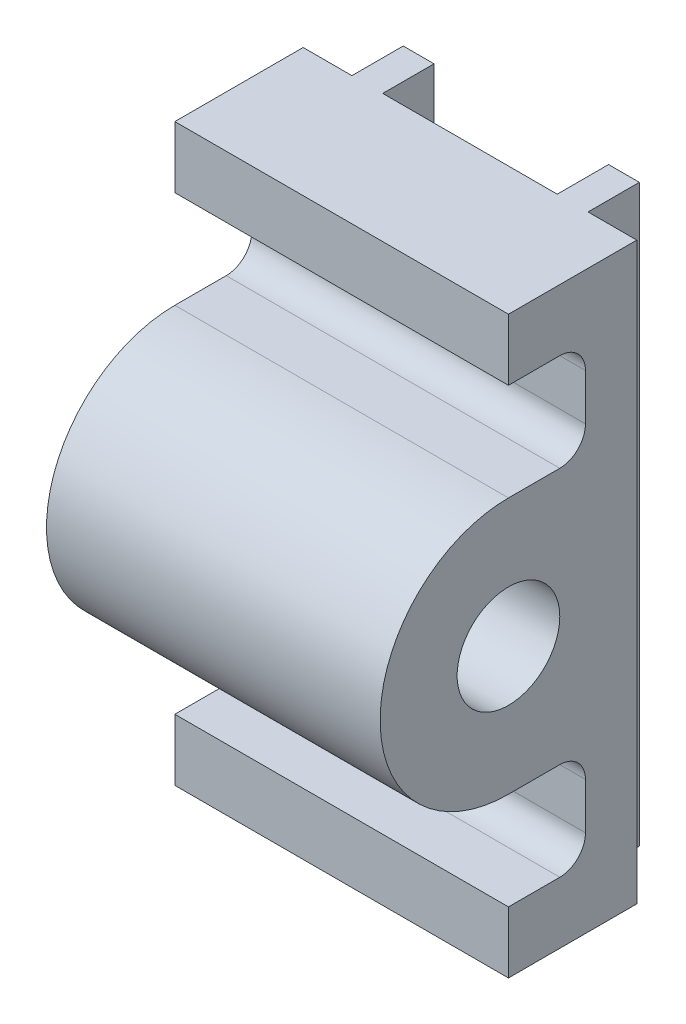
ISO-10303-21;
HEADER;
FILE_DESCRIPTION(('STEP AP214'),'2;1');
FILE_NAME('part.step','',(''),(''),'','','');
FILE_SCHEMA(('AUTOMOTIVE_DESIGN { 1 0 10303 214 1 1 1 1 }'));
ENDSEC;
DATA;
#1=APPLICATION_CONTEXT('core data for automotive mechanical design processes');
#2=APPLICATION_PROTOCOL_DEFINITION('international standard','automotive_design',2000,#1);
#3=PRODUCT_CONTEXT('',#1,'mechanical');
#4=PRODUCT('Part','Part','',(#3));
#5=PRODUCT_RELATED_PRODUCT_CATEGORY('part','',(#4));
#6=PRODUCT_DEFINITION_FORMATION('','',#4);
#7=PRODUCT_DEFINITION_CONTEXT('part definition',#1,'design');
#8=PRODUCT_DEFINITION('design','',#6,#7);
#9=PRODUCT_DEFINITION_SHAPE('','',#8);
#10=(LENGTH_UNIT() NAMED_UNIT(*) SI_UNIT(.MILLI.,.METRE.));
#11=(NAMED_UNIT(*) PLANE_ANGLE_UNIT() SI_UNIT($,.RADIAN.));
#12=(NAMED_UNIT(*) SI_UNIT($,.STERADIAN.) SOLID_ANGLE_UNIT());
#13=UNCERTAINTY_MEASURE_WITH_UNIT(LENGTH_MEASURE(1.E-05),#10,'distance_accuracy_value','');
#14=(GEOMETRIC_REPRESENTATION_CONTEXT(3) GLOBAL_UNCERTAINTY_ASSIGNED_CONTEXT((#13)) GLOBAL_UNIT_ASSIGNED_CONTEXT((#10,
#11,#12)) REPRESENTATION_CONTEXT('',''));
#15=CARTESIAN_POINT('',(0.,0.,0.));
#16=DIRECTION('',(0.,0.,1.));
#17=DIRECTION('',(1.,0.,0.));
#18=AXIS2_PLACEMENT_3D('',#15,#16,#17);
#19=CARTESIAN_POINT('',(32.5,-56.,-25.));
#20=DIRECTION('',(0.,0.,1.));
#21=DIRECTION('',(1.,0.,0.));
#22=AXIS2_PLACEMENT_3D('',#19,#20,#21);
#23=PLANE('',#22);
#24=DIRECTION('',(0.,1.,0.));
#25=VECTOR('',#24,1.);
#26=CARTESIAN_POINT('',(-23.,-56.,-25.));
#27=LINE('',#26,#25);
#28=CARTESIAN_POINT('',(-23.,-56.,-25.));
#29=VERTEX_POINT('',#28);
#30=CARTESIAN_POINT('',(-23.,56.,-25.));
#31=VERTEX_POINT('',#30);
#32=EDGE_CURVE('E54',#29,#31,#27,.T.);
#33=ORIENTED_EDGE('',*,*,#32,.F.);
#34=DIRECTION('',(-1.,0.,0.));
#35=VECTOR('',#34,1.);
#36=CARTESIAN_POINT('',(32.5,-56.,-25.));
#37=LINE('',#36,#35);
#38=CARTESIAN_POINT('',(-32.5,-56.,-25.));
#39=VERTEX_POINT('',#38);
#40=EDGE_CURVE('E352',#29,#39,#37,.T.);
#41=ORIENTED_EDGE('',*,*,#40,.T.);
#42=DIRECTION('',(0.,1.,0.));
#43=VECTOR('',#42,1.);
#44=CARTESIAN_POINT('',(-32.5,-56.,-25.));
#45=LINE('',#44,#43);
#46=CARTESIAN_POINT('',(-32.5,56.,-25.));
#47=VERTEX_POINT('',#46);
#48=EDGE_CURVE('E312',#39,#47,#45,.T.);
#49=ORIENTED_EDGE('',*,*,#48,.T.);
#50=DIRECTION('',(-1.,0.,0.));
#51=VECTOR('',#50,1.);
#52=CARTESIAN_POINT('',(32.5,56.,-25.));
#53=LINE('',#52,#51);
#54=EDGE_CURVE('E348',#31,#47,#53,.T.);
#55=ORIENTED_EDGE('',*,*,#54,.F.);
#56=EDGE_LOOP('',(#33,#41,#49,#55));
#57=FACE_BOUND('',#56,.T.);
#58=ADVANCED_FACE('F39',(#57),#23,.F.);
#59=DIRECTION('',(0.,-1.,0.));
#60=VECTOR('',#59,1.);
#61=CARTESIAN_POINT('',(-17.,-56.,-25.));
#62=LINE('',#61,#60);
#63=CARTESIAN_POINT('',(-17.,56.,-25.));
#64=VERTEX_POINT('',#63);
#65=CARTESIAN_POINT('',(-17.,-56.,-25.));
#66=VERTEX_POINT('',#65);
#67=EDGE_CURVE('E220',#64,#66,#62,.T.);
#68=ORIENTED_EDGE('',*,*,#67,.F.);
#69=CARTESIAN_POINT('',(17.,56.,-25.));
#70=VERTEX_POINT('',#69);
#71=EDGE_CURVE('E353',#70,#64,#53,.T.);
#72=ORIENTED_EDGE('',*,*,#71,.F.);
#73=DIRECTION('',(0.,1.,0.));
#74=VECTOR('',#73,1.);
#75=CARTESIAN_POINT('',(17.,-56.,-25.));
#76=LINE('',#75,#74);
#77=CARTESIAN_POINT('',(17.,-56.,-25.));
#78=VERTEX_POINT('',#77);
#79=EDGE_CURVE('E62',#78,#70,#76,.T.);
#80=ORIENTED_EDGE('',*,*,#79,.F.);
#81=EDGE_CURVE('E357',#78,#66,#37,.T.);
#82=ORIENTED_EDGE('',*,*,#81,.T.);
#83=EDGE_LOOP('',(#68,#72,#80,#82));
#84=FACE_BOUND('',#83,.T.);
#85=ADVANCED_FACE('F457',(#84),#23,.F.);
#86=DIRECTION('',(0.,-1.,0.));
#87=VECTOR('',#86,1.);
#88=CARTESIAN_POINT('',(23.,-56.,-25.));
#89=LINE('',#88,#87);
#90=CARTESIAN_POINT('',(23.,56.,-25.));
#91=VERTEX_POINT('',#90);
#92=CARTESIAN_POINT('',(23.,-56.,-25.));
#93=VERTEX_POINT('',#92);
#94=EDGE_CURVE('E246',#91,#93,#89,.T.);
#95=ORIENTED_EDGE('',*,*,#94,.F.);
#96=CARTESIAN_POINT('',(32.5,56.,-25.));
#97=VERTEX_POINT('',#96);
#98=EDGE_CURVE('E349',#97,#91,#53,.T.);
#99=ORIENTED_EDGE('',*,*,#98,.F.);
#100=DIRECTION('',(0.,1.,0.));
#101=VECTOR('',#100,1.);
#102=CARTESIAN_POINT('',(32.5,-56.,-25.));
#103=LINE('',#102,#101);
#104=CARTESIAN_POINT('',(32.5,-56.,-25.));
#105=VERTEX_POINT('',#104);
#106=EDGE_CURVE('E278',#105,#97,#103,.T.);
#107=ORIENTED_EDGE('',*,*,#106,.F.);
#108=EDGE_CURVE('E354',#105,#93,#37,.T.);
#109=ORIENTED_EDGE('',*,*,#108,.T.);
#110=EDGE_LOOP('',(#95,#99,#107,#109));
#111=FACE_BOUND('',#110,.T.);
#112=ADVANCED_FACE('F459',(#111),#23,.F.);
#113=CARTESIAN_POINT('',(32.5,0.,0.));
#114=DIRECTION('',(1.,0.,0.));
#115=DIRECTION('',(0.,0.,-1.));
#116=AXIS2_PLACEMENT_3D('',#113,#114,#115);
#117=PLANE('',#116);
#118=CARTESIAN_POINT('',(32.5,0.,0.));
#119=DIRECTION('',(1.,0.,0.));
#120=DIRECTION('',(0.,0.,-1.));
#121=AXIS2_PLACEMENT_3D('',#118,#119,#120);
#122=CIRCLE('',#121,25.);
#123=CARTESIAN_POINT('',(32.5,25.,0.));
#124=VERTEX_POINT('',#123);
#125=CARTESIAN_POINT('',(32.5,-25.,0.));
#126=VERTEX_POINT('',#125);
#127=EDGE_CURVE('E260',#124,#126,#122,.T.);
#128=ORIENTED_EDGE('',*,*,#127,.T.);
#129=DIRECTION('',(0.,0.,-1.));
#130=VECTOR('',#129,1.);
#131=CARTESIAN_POINT('',(32.5,-25.,0.));
#132=LINE('',#131,#130);
#133=CARTESIAN_POINT('',(32.5,-25.,-9.99999999999999));
#134=VERTEX_POINT('',#133);
#135=EDGE_CURVE('E263',#126,#134,#132,.T.);
#136=ORIENTED_EDGE('',*,*,#135,.T.);
#137=CARTESIAN_POINT('',(32.5,-30.,-9.99999999999999));
#138=DIRECTION('',(-1.,0.,0.));
#139=DIRECTION('',(0.,0.,1.));
#140=AXIS2_PLACEMENT_3D('',#137,#138,#139);
#141=CIRCLE('',#140,5.);
#142=CARTESIAN_POINT('',(32.5,-30.,-15.));
#143=VERTEX_POINT('',#142);
#144=EDGE_CURVE('E266',#134,#143,#141,.T.);
#145=ORIENTED_EDGE('',*,*,#144,.T.);
#146=DIRECTION('',(0.,-1.,0.));
#147=VECTOR('',#146,1.);
#148=CARTESIAN_POINT('',(32.5,-30.,-15.));
#149=LINE('',#148,#147);
#150=CARTESIAN_POINT('',(32.5,-39.,-15.));
#151=VERTEX_POINT('',#150);
#152=EDGE_CURVE('E268',#143,#151,#149,.T.);
#153=ORIENTED_EDGE('',*,*,#152,.T.);
#154=CARTESIAN_POINT('',(32.5,-39.,-10.));
#155=DIRECTION('',(-1.,0.,0.));
#156=DIRECTION('',(0.,0.,1.));
#157=AXIS2_PLACEMENT_3D('',#154,#155,#156);
#158=CIRCLE('',#157,5.);
#159=CARTESIAN_POINT('',(32.5,-44.,-10.));
#160=VERTEX_POINT('',#159);
#161=EDGE_CURVE('E270',#151,#160,#158,.T.);
#162=ORIENTED_EDGE('',*,*,#161,.T.);
#163=DIRECTION('',(0.,0.,1.));
#164=VECTOR('',#163,1.);
#165=CARTESIAN_POINT('',(32.5,-44.,-10.));
#166=LINE('',#165,#164);
#167=CARTESIAN_POINT('',(32.5,-44.,0.));
#168=VERTEX_POINT('',#167);
#169=EDGE_CURVE('E272',#160,#168,#166,.T.);
#170=ORIENTED_EDGE('',*,*,#169,.T.);
#171=DIRECTION('',(0.,-1.,0.));
#172=VECTOR('',#171,1.);
#173=CARTESIAN_POINT('',(32.5,-44.,0.));
#174=LINE('',#173,#172);
#175=CARTESIAN_POINT('',(32.5,-56.,0.));
#176=VERTEX_POINT('',#175);
#177=EDGE_CURVE('E274',#168,#176,#174,.T.);
#178=ORIENTED_EDGE('',*,*,#177,.T.);
#179=DIRECTION('',(0.,0.,-1.));
#180=VECTOR('',#179,1.);
#181=CARTESIAN_POINT('',(32.5,-56.,0.));
#182=LINE('',#181,#180);
#183=EDGE_CURVE('E276',#176,#105,#182,.T.);
#184=ORIENTED_EDGE('',*,*,#183,.T.);
#185=ORIENTED_EDGE('',*,*,#106,.T.);
#186=DIRECTION('',(0.,0.,1.));
#187=VECTOR('',#186,1.);
#188=CARTESIAN_POINT('',(32.5,56.,0.));
#189=LINE('',#188,#187);
#190=CARTESIAN_POINT('',(32.5,56.,0.));
#191=VERTEX_POINT('',#190);
#192=EDGE_CURVE('E280',#97,#191,#189,.T.);
#193=ORIENTED_EDGE('',*,*,#192,.T.);
#194=DIRECTION('',(0.,-1.,0.));
#195=VECTOR('',#194,1.);
#196=CARTESIAN_POINT('',(32.5,44.,0.));
#197=LINE('',#196,#195);
#198=CARTESIAN_POINT('',(32.5,44.,0.));
#199=VERTEX_POINT('',#198);
#200=EDGE_CURVE('E282',#191,#199,#197,.T.);
#201=ORIENTED_EDGE('',*,*,#200,.T.);
#202=DIRECTION('',(0.,0.,-1.));
#203=VECTOR('',#202,1.);
#204=CARTESIAN_POINT('',(32.5,44.,-10.));
#205=LINE('',#204,#203);
#206=CARTESIAN_POINT('',(32.5,44.,-10.));
#207=VERTEX_POINT('',#206);
#208=EDGE_CURVE('E284',#199,#207,#205,.T.);
#209=ORIENTED_EDGE('',*,*,#208,.T.);
#210=CARTESIAN_POINT('',(32.5,39.,-10.));
#211=DIRECTION('',(-1.,0.,0.));
#212=DIRECTION('',(0.,0.,-1.));
#213=AXIS2_PLACEMENT_3D('',#210,#211,#212);
#214=CIRCLE('',#213,5.);
#215=CARTESIAN_POINT('',(32.5,39.,-15.));
#216=VERTEX_POINT('',#215);
#217=EDGE_CURVE('E286',#207,#216,#214,.T.);
#218=ORIENTED_EDGE('',*,*,#217,.T.);
#219=DIRECTION('',(0.,-1.,0.));
#220=VECTOR('',#219,1.);
#221=CARTESIAN_POINT('',(32.5,30.,-15.));
#222=LINE('',#221,#220);
#223=CARTESIAN_POINT('',(32.5,30.,-15.));
#224=VERTEX_POINT('',#223);
#225=EDGE_CURVE('E288',#216,#224,#222,.T.);
#226=ORIENTED_EDGE('',*,*,#225,.T.);
#227=CARTESIAN_POINT('',(32.5,30.,-9.99999999999999));
#228=DIRECTION('',(-1.,0.,0.));
#229=DIRECTION('',(0.,0.,-1.));
#230=AXIS2_PLACEMENT_3D('',#227,#228,#229);
#231=CIRCLE('',#230,5.);
#232=CARTESIAN_POINT('',(32.5,25.,-9.99999999999999));
#233=VERTEX_POINT('',#232);
#234=EDGE_CURVE('E290',#224,#233,#231,.T.);
#235=ORIENTED_EDGE('',*,*,#234,.T.);
#236=DIRECTION('',(0.,0.,1.));
#237=VECTOR('',#236,1.);
#238=CARTESIAN_POINT('',(32.5,25.,0.));
#239=LINE('',#238,#237);
#240=EDGE_CURVE('E292',#233,#124,#239,.T.);
#241=ORIENTED_EDGE('',*,*,#240,.T.);
#242=EDGE_LOOP('',(#128,#136,#145,#153,#162,#170,#178,#184,#185,#193,#201,#209,#218,#226,#235,#241));
#243=FACE_BOUND('',#242,.T.);
#244=CARTESIAN_POINT('',(32.5,0.,0.));
#245=DIRECTION('',(1.,0.,0.));
#246=DIRECTION('',(0.,0.,-1.));
#247=AXIS2_PLACEMENT_3D('',#244,#245,#246);
#248=CIRCLE('',#247,10.);
#249=CARTESIAN_POINT('',(32.5,0.,-10.));
#250=VERTEX_POINT('',#249);
#251=EDGE_CURVE('E226',#250,#250,#248,.T.);
#252=ORIENTED_EDGE('',*,*,#251,.F.);
#253=EDGE_LOOP('',(#252));
#254=FACE_BOUND('',#253,.T.);
#255=ADVANCED_FACE('F396',(#243,#254),#117,.T.);
#256=CARTESIAN_POINT('',(-32.5,0.,0.));
#257=DIRECTION('',(1.,0.,0.));
#258=DIRECTION('',(0.,0.,-1.));
#259=AXIS2_PLACEMENT_3D('',#256,#257,#258);
#260=PLANE('',#259);
#261=CARTESIAN_POINT('',(-32.5,0.,0.));
#262=DIRECTION('',(1.,0.,0.));
#263=DIRECTION('',(0.,0.,-1.));
#264=AXIS2_PLACEMENT_3D('',#261,#262,#263);
#265=CIRCLE('',#264,25.);
#266=CARTESIAN_POINT('',(-32.5,25.,0.));
#267=VERTEX_POINT('',#266);
#268=CARTESIAN_POINT('',(-32.5,-25.,0.));
#269=VERTEX_POINT('',#268);
#270=EDGE_CURVE('E258',#267,#269,#265,.T.);
#271=ORIENTED_EDGE('',*,*,#270,.F.);
#272=DIRECTION('',(0.,0.,1.));
#273=VECTOR('',#272,1.);
#274=CARTESIAN_POINT('',(-32.5,25.,0.));
#275=LINE('',#274,#273);
#276=CARTESIAN_POINT('',(-32.5,25.,-9.99999999999999));
#277=VERTEX_POINT('',#276);
#278=EDGE_CURVE('E264',#277,#267,#275,.T.);
#279=ORIENTED_EDGE('',*,*,#278,.F.);
#280=CARTESIAN_POINT('',(-32.5,30.,-9.99999999999999));
#281=DIRECTION('',(-1.,0.,0.));
#282=DIRECTION('',(0.,0.,-1.));
#283=AXIS2_PLACEMENT_3D('',#280,#281,#282);
#284=CIRCLE('',#283,5.);
#285=CARTESIAN_POINT('',(-32.5,30.,-15.));
#286=VERTEX_POINT('',#285);
#287=EDGE_CURVE('E325',#286,#277,#284,.T.);
#288=ORIENTED_EDGE('',*,*,#287,.F.);
#289=DIRECTION('',(0.,-1.,0.));
#290=VECTOR('',#289,1.);
#291=CARTESIAN_POINT('',(-32.5,30.,-15.));
#292=LINE('',#291,#290);
#293=CARTESIAN_POINT('',(-32.5,39.,-15.));
#294=VERTEX_POINT('',#293);
#295=EDGE_CURVE('E323',#294,#286,#292,.T.);
#296=ORIENTED_EDGE('',*,*,#295,.F.);
#297=CARTESIAN_POINT('',(-32.5,39.,-10.));
#298=DIRECTION('',(-1.,0.,0.));
#299=DIRECTION('',(0.,0.,-1.));
#300=AXIS2_PLACEMENT_3D('',#297,#298,#299);
#301=CIRCLE('',#300,5.);
#302=CARTESIAN_POINT('',(-32.5,44.,-10.));
#303=VERTEX_POINT('',#302);
#304=EDGE_CURVE('E321',#303,#294,#301,.T.);
#305=ORIENTED_EDGE('',*,*,#304,.F.);
#306=DIRECTION('',(0.,0.,-1.));
#307=VECTOR('',#306,1.);
#308=CARTESIAN_POINT('',(-32.5,44.,-10.));
#309=LINE('',#308,#307);
#310=CARTESIAN_POINT('',(-32.5,44.,0.));
#311=VERTEX_POINT('',#310);
#312=EDGE_CURVE('E319',#311,#303,#309,.T.);
#313=ORIENTED_EDGE('',*,*,#312,.F.);
#314=DIRECTION('',(0.,-1.,0.));
#315=VECTOR('',#314,1.);
#316=CARTESIAN_POINT('',(-32.5,44.,0.));
#317=LINE('',#316,#315);
#318=CARTESIAN_POINT('',(-32.5,56.,0.));
#319=VERTEX_POINT('',#318);
#320=EDGE_CURVE('E317',#319,#311,#317,.T.);
#321=ORIENTED_EDGE('',*,*,#320,.F.);
#322=DIRECTION('',(0.,0.,1.));
#323=VECTOR('',#322,1.);
#324=CARTESIAN_POINT('',(-32.5,56.,0.));
#325=LINE('',#324,#323);
#326=EDGE_CURVE('E315',#47,#319,#325,.T.);
#327=ORIENTED_EDGE('',*,*,#326,.F.);
#328=ORIENTED_EDGE('',*,*,#48,.F.);
#329=DIRECTION('',(0.,0.,-1.));
#330=VECTOR('',#329,1.);
#331=CARTESIAN_POINT('',(-32.5,-56.,0.));
#332=LINE('',#331,#330);
#333=CARTESIAN_POINT('',(-32.5,-56.,0.));
#334=VERTEX_POINT('',#333);
#335=EDGE_CURVE('E309',#334,#39,#332,.T.);
#336=ORIENTED_EDGE('',*,*,#335,.F.);
#337=DIRECTION('',(0.,-1.,0.));
#338=VECTOR('',#337,1.);
#339=CARTESIAN_POINT('',(-32.5,-44.,0.));
#340=LINE('',#339,#338);
#341=CARTESIAN_POINT('',(-32.5,-44.,0.));
#342=VERTEX_POINT('',#341);
#343=EDGE_CURVE('E307',#342,#334,#340,.T.);
#344=ORIENTED_EDGE('',*,*,#343,.F.);
#345=DIRECTION('',(0.,0.,1.));
#346=VECTOR('',#345,1.);
#347=CARTESIAN_POINT('',(-32.5,-44.,-10.));
#348=LINE('',#347,#346);
#349=CARTESIAN_POINT('',(-32.5,-44.,-10.));
#350=VERTEX_POINT('',#349);
#351=EDGE_CURVE('E305',#350,#342,#348,.T.);
#352=ORIENTED_EDGE('',*,*,#351,.F.);
#353=CARTESIAN_POINT('',(-32.5,-39.,-10.));
#354=DIRECTION('',(-1.,0.,0.));
#355=DIRECTION('',(0.,0.,1.));
#356=AXIS2_PLACEMENT_3D('',#353,#354,#355);
#357=CIRCLE('',#356,5.);
#358=CARTESIAN_POINT('',(-32.5,-39.,-15.));
#359=VERTEX_POINT('',#358);
#360=EDGE_CURVE('E303',#359,#350,#357,.T.);
#361=ORIENTED_EDGE('',*,*,#360,.F.);
#362=DIRECTION('',(0.,-1.,0.));
#363=VECTOR('',#362,1.);
#364=CARTESIAN_POINT('',(-32.5,-30.,-15.));
#365=LINE('',#364,#363);
#366=CARTESIAN_POINT('',(-32.5,-30.,-15.));
#367=VERTEX_POINT('',#366);
#368=EDGE_CURVE('E301',#367,#359,#365,.T.);
#369=ORIENTED_EDGE('',*,*,#368,.F.);
#370=CARTESIAN_POINT('',(-32.5,-30.,-9.99999999999999));
#371=DIRECTION('',(-1.,0.,0.));
#372=DIRECTION('',(0.,0.,1.));
#373=AXIS2_PLACEMENT_3D('',#370,#371,#372);
#374=CIRCLE('',#373,5.);
#375=CARTESIAN_POINT('',(-32.5,-25.,-9.99999999999999));
#376=VERTEX_POINT('',#375);
#377=EDGE_CURVE('E299',#376,#367,#374,.T.);
#378=ORIENTED_EDGE('',*,*,#377,.F.);
#379=DIRECTION('',(0.,0.,-1.));
#380=VECTOR('',#379,1.);
#381=CARTESIAN_POINT('',(-32.5,-25.,0.));
#382=LINE('',#381,#380);
#383=EDGE_CURVE('E297',#269,#376,#382,.T.);
#384=ORIENTED_EDGE('',*,*,#383,.F.);
#385=EDGE_LOOP('',(#271,#279,#288,#296,#305,#313,#321,#327,#328,#336,#344,#352,#361,#369,#378,#384));
#386=FACE_BOUND('',#385,.T.);
#387=CARTESIAN_POINT('',(-32.5,0.,0.));
#388=DIRECTION('',(1.,0.,0.));
#389=DIRECTION('',(0.,0.,-1.));
#390=AXIS2_PLACEMENT_3D('',#387,#388,#389);
#391=CIRCLE('',#390,10.);
#392=CARTESIAN_POINT('',(-32.5,0.,-10.));
#393=VERTEX_POINT('',#392);
#394=EDGE_CURVE('E223',#393,#393,#391,.T.);
#395=ORIENTED_EDGE('',*,*,#394,.T.);
#396=EDGE_LOOP('',(#395));
#397=FACE_BOUND('',#396,.T.);
#398=ADVANCED_FACE('F382',(#386,#397),#260,.F.);
#399=CARTESIAN_POINT('',(32.5,0.,0.));
#400=DIRECTION('',(-1.,0.,0.));
#401=DIRECTION('',(0.,0.,1.));
#402=AXIS2_PLACEMENT_3D('',#399,#400,#401);
#403=CYLINDRICAL_SURFACE('',#402,25.);
#404=ORIENTED_EDGE('',*,*,#270,.T.);
#405=DIRECTION('',(-1.,0.,0.));
#406=VECTOR('',#405,1.);
#407=CARTESIAN_POINT('',(32.5,-25.,0.));
#408=LINE('',#407,#406);
#409=EDGE_CURVE('E11',#126,#269,#408,.T.);
#410=ORIENTED_EDGE('',*,*,#409,.F.);
#411=ORIENTED_EDGE('',*,*,#127,.F.);
#412=DIRECTION('',(-1.,0.,0.));
#413=VECTOR('',#412,1.);
#414=CARTESIAN_POINT('',(32.5,25.,0.));
#415=LINE('',#414,#413);
#416=EDGE_CURVE('E294',#124,#267,#415,.T.);
#417=ORIENTED_EDGE('',*,*,#416,.T.);
#418=EDGE_LOOP('',(#404,#410,#411,#417));
#419=FACE_BOUND('',#418,.T.);
#420=ADVANCED_FACE('F41',(#419),#403,.T.);
#421=CARTESIAN_POINT('',(32.5,-25.,0.));
#422=DIRECTION('',(0.,1.,0.));
#423=DIRECTION('',(0.,0.,1.));
#424=AXIS2_PLACEMENT_3D('',#421,#422,#423);
#425=PLANE('',#424);
#426=ORIENTED_EDGE('',*,*,#383,.T.);
#427=DIRECTION('',(-1.,0.,0.));
#428=VECTOR('',#427,1.);
#429=CARTESIAN_POINT('',(32.5,-25.,-9.99999999999999));
#430=LINE('',#429,#428);
#431=EDGE_CURVE('E47',#134,#376,#430,.T.);
#432=ORIENTED_EDGE('',*,*,#431,.F.);
#433=ORIENTED_EDGE('',*,*,#135,.F.);
#434=ORIENTED_EDGE('',*,*,#409,.T.);
#435=EDGE_LOOP('',(#426,#432,#433,#434));
#436=FACE_BOUND('',#435,.T.);
#437=ADVANCED_FACE('F401',(#436),#425,.F.);
#438=CARTESIAN_POINT('',(32.5,-30.,-9.99999999999999));
#439=DIRECTION('',(-1.,0.,0.));
#440=DIRECTION('',(0.,0.,1.));
#441=AXIS2_PLACEMENT_3D('',#438,#439,#440);
#442=CYLINDRICAL_SURFACE('',#441,5.);
#443=ORIENTED_EDGE('',*,*,#377,.T.);
#444=DIRECTION('',(-1.,0.,0.));
#445=VECTOR('',#444,1.);
#446=CARTESIAN_POINT('',(32.5,-30.,-15.));
#447=LINE('',#446,#445);
#448=EDGE_CURVE('E369',#143,#367,#447,.T.);
#449=ORIENTED_EDGE('',*,*,#448,.F.);
#450=ORIENTED_EDGE('',*,*,#144,.F.);
#451=ORIENTED_EDGE('',*,*,#431,.T.);
#452=EDGE_LOOP('',(#443,#449,#450,#451));
#453=FACE_BOUND('',#452,.T.);
#454=ADVANCED_FACE('F376',(#453),#442,.F.);
#455=CARTESIAN_POINT('',(32.5,-30.,-15.));
#456=DIRECTION('',(0.,0.,-1.));
#457=DIRECTION('',(0.,1.,0.));
#458=AXIS2_PLACEMENT_3D('',#455,#456,#457);
#459=PLANE('',#458);
#460=ORIENTED_EDGE('',*,*,#368,.T.);
#461=DIRECTION('',(-1.,0.,0.));
#462=VECTOR('',#461,1.);
#463=CARTESIAN_POINT('',(32.5,-39.,-15.));
#464=LINE('',#463,#462);
#465=EDGE_CURVE('E366',#151,#359,#464,.T.);
#466=ORIENTED_EDGE('',*,*,#465,.F.);
#467=ORIENTED_EDGE('',*,*,#152,.F.);
#468=ORIENTED_EDGE('',*,*,#448,.T.);
#469=EDGE_LOOP('',(#460,#466,#467,#468));
#470=FACE_BOUND('',#469,.T.);
#471=ADVANCED_FACE('F388',(#470),#459,.F.);
#472=CARTESIAN_POINT('',(32.5,-39.,-10.));
#473=DIRECTION('',(-1.,0.,0.));
#474=DIRECTION('',(0.,0.,1.));
#475=AXIS2_PLACEMENT_3D('',#472,#473,#474);
#476=CYLINDRICAL_SURFACE('',#475,5.);
#477=ORIENTED_EDGE('',*,*,#360,.T.);
#478=DIRECTION('',(-1.,0.,0.));
#479=VECTOR('',#478,1.);
#480=CARTESIAN_POINT('',(32.5,-44.,-10.));
#481=LINE('',#480,#479);
#482=EDGE_CURVE('E363',#160,#350,#481,.T.);
#483=ORIENTED_EDGE('',*,*,#482,.F.);
#484=ORIENTED_EDGE('',*,*,#161,.F.);
#485=ORIENTED_EDGE('',*,*,#465,.T.);
#486=EDGE_LOOP('',(#477,#483,#484,#485));
#487=FACE_BOUND('',#486,.T.);
#488=ADVANCED_FACE('F392',(#487),#476,.F.);
#489=CARTESIAN_POINT('',(32.5,-44.,-10.));
#490=DIRECTION('',(0.,-1.,0.));
#491=DIRECTION('',(0.,0.,-1.));
#492=AXIS2_PLACEMENT_3D('',#489,#490,#491);
#493=PLANE('',#492);
#494=ORIENTED_EDGE('',*,*,#351,.T.);
#495=DIRECTION('',(-1.,0.,0.));
#496=VECTOR('',#495,1.);
#497=CARTESIAN_POINT('',(32.5,-44.,0.));
#498=LINE('',#497,#496);
#499=EDGE_CURVE('E360',#168,#342,#498,.T.);
#500=ORIENTED_EDGE('',*,*,#499,.F.);
#501=ORIENTED_EDGE('',*,*,#169,.F.);
#502=ORIENTED_EDGE('',*,*,#482,.T.);
#503=EDGE_LOOP('',(#494,#500,#501,#502));
#504=FACE_BOUND('',#503,.T.);
#505=ADVANCED_FACE('F447',(#504),#493,.F.);
#506=CARTESIAN_POINT('',(32.5,-44.,0.));
#507=DIRECTION('',(0.,0.,-1.));
#508=DIRECTION('',(0.,1.,0.));
#509=AXIS2_PLACEMENT_3D('',#506,#507,#508);
#510=PLANE('',#509);
#511=ORIENTED_EDGE('',*,*,#343,.T.);
#512=DIRECTION('',(-1.,0.,0.));
#513=VECTOR('',#512,1.);
#514=CARTESIAN_POINT('',(32.5,-56.,0.));
#515=LINE('',#514,#513);
#516=EDGE_CURVE('E356',#176,#334,#515,.T.);
#517=ORIENTED_EDGE('',*,*,#516,.F.);
#518=ORIENTED_EDGE('',*,*,#177,.F.);
#519=ORIENTED_EDGE('',*,*,#499,.T.);
#520=EDGE_LOOP('',(#511,#517,#518,#519));
#521=FACE_BOUND('',#520,.T.);
#522=ADVANCED_FACE('F444',(#521),#510,.F.);
#523=CARTESIAN_POINT('',(32.5,-56.,0.));
#524=DIRECTION('',(0.,1.,0.));
#525=DIRECTION('',(0.,0.,1.));
#526=AXIS2_PLACEMENT_3D('',#523,#524,#525);
#527=PLANE('',#526);
#528=ORIENTED_EDGE('',*,*,#335,.T.);
#529=ORIENTED_EDGE('',*,*,#40,.F.);
#530=DIRECTION('',(0.,0.,1.));
#531=VECTOR('',#530,1.);
#532=CARTESIAN_POINT('',(-23.,-56.,-35.));
#533=LINE('',#532,#531);
#534=CARTESIAN_POINT('',(-23.,-56.,-35.));
#535=VERTEX_POINT('',#534);
#536=EDGE_CURVE('E498',#535,#29,#533,.T.);
#537=ORIENTED_EDGE('',*,*,#536,.F.);
#538=DIRECTION('',(-1.,0.,0.));
#539=VECTOR('',#538,1.);
#540=CARTESIAN_POINT('',(-23.,-56.,-35.));
#541=LINE('',#540,#539);
#542=CARTESIAN_POINT('',(-17.,-56.,-35.));
#543=VERTEX_POINT('',#542);
#544=EDGE_CURVE('E216',#543,#535,#541,.T.);
#545=ORIENTED_EDGE('',*,*,#544,.F.);
#546=DIRECTION('',(0.,0.,1.));
#547=VECTOR('',#546,1.);
#548=CARTESIAN_POINT('',(-17.,-56.,-35.));
#549=LINE('',#548,#547);
#550=EDGE_CURVE('E228',#543,#66,#549,.T.);
#551=ORIENTED_EDGE('',*,*,#550,.T.);
#552=ORIENTED_EDGE('',*,*,#81,.F.);
#553=DIRECTION('',(0.,0.,1.));
#554=VECTOR('',#553,1.);
#555=CARTESIAN_POINT('',(17.,-56.,-35.));
#556=LINE('',#555,#554);
#557=CARTESIAN_POINT('',(17.,-56.,-35.));
#558=VERTEX_POINT('',#557);
#559=EDGE_CURVE('E235',#558,#78,#556,.T.);
#560=ORIENTED_EDGE('',*,*,#559,.F.);
#561=DIRECTION('',(-1.,0.,0.));
#562=VECTOR('',#561,1.);
#563=CARTESIAN_POINT('',(23.,-56.,-35.));
#564=LINE('',#563,#562);
#565=CARTESIAN_POINT('',(23.,-56.,-35.));
#566=VERTEX_POINT('',#565);
#567=EDGE_CURVE('E253',#566,#558,#564,.T.);
#568=ORIENTED_EDGE('',*,*,#567,.F.);
#569=DIRECTION('',(0.,0.,1.));
#570=VECTOR('',#569,1.);
#571=CARTESIAN_POINT('',(23.,-56.,-35.));
#572=LINE('',#571,#570);
#573=EDGE_CURVE('E232',#566,#93,#572,.T.);
#574=ORIENTED_EDGE('',*,*,#573,.T.);
#575=ORIENTED_EDGE('',*,*,#108,.F.);
#576=ORIENTED_EDGE('',*,*,#183,.F.);
#577=ORIENTED_EDGE('',*,*,#516,.T.);
#578=EDGE_LOOP('',(#528,#529,#537,#545,#551,#552,#560,#568,#574,#575,#576,#577));
#579=FACE_BOUND('',#578,.T.);
#580=ADVANCED_FACE('F439',(#579),#527,.F.);
#581=CARTESIAN_POINT('',(32.5,56.,0.));
#582=DIRECTION('',(0.,-1.,0.));
#583=DIRECTION('',(0.,0.,-1.));
#584=AXIS2_PLACEMENT_3D('',#581,#582,#583);
#585=PLANE('',#584);
#586=ORIENTED_EDGE('',*,*,#326,.T.);
#587=DIRECTION('',(-1.,0.,0.));
#588=VECTOR('',#587,1.);
#589=CARTESIAN_POINT('',(32.5,56.,0.));
#590=LINE('',#589,#588);
#591=EDGE_CURVE('E345',#191,#319,#590,.T.);
#592=ORIENTED_EDGE('',*,*,#591,.F.);
#593=ORIENTED_EDGE('',*,*,#192,.F.);
#594=ORIENTED_EDGE('',*,*,#98,.T.);
#595=DIRECTION('',(0.,0.,1.));
#596=VECTOR('',#595,1.);
#597=CARTESIAN_POINT('',(23.,56.,-35.));
#598=LINE('',#597,#596);
#599=CARTESIAN_POINT('',(23.,56.,-35.));
#600=VERTEX_POINT('',#599);
#601=EDGE_CURVE('E241',#600,#91,#598,.T.);
#602=ORIENTED_EDGE('',*,*,#601,.F.);
#603=DIRECTION('',(1.,0.,0.));
#604=VECTOR('',#603,1.);
#605=CARTESIAN_POINT('',(23.,56.,-35.));
#606=LINE('',#605,#604);
#607=CARTESIAN_POINT('',(17.,56.,-35.));
#608=VERTEX_POINT('',#607);
#609=EDGE_CURVE('E244',#608,#600,#606,.T.);
#610=ORIENTED_EDGE('',*,*,#609,.F.);
#611=DIRECTION('',(0.,0.,1.));
#612=VECTOR('',#611,1.);
#613=CARTESIAN_POINT('',(17.,56.,-35.));
#614=LINE('',#613,#612);
#615=EDGE_CURVE('E238',#608,#70,#614,.T.);
#616=ORIENTED_EDGE('',*,*,#615,.T.);
#617=ORIENTED_EDGE('',*,*,#71,.T.);
#618=DIRECTION('',(0.,0.,1.));
#619=VECTOR('',#618,1.);
#620=CARTESIAN_POINT('',(-17.,56.,-35.));
#621=LINE('',#620,#619);
#622=CARTESIAN_POINT('',(-17.,56.,-35.));
#623=VERTEX_POINT('',#622);
#624=EDGE_CURVE('E207',#623,#64,#621,.T.);
#625=ORIENTED_EDGE('',*,*,#624,.F.);
#626=DIRECTION('',(1.,0.,0.));
#627=VECTOR('',#626,1.);
#628=CARTESIAN_POINT('',(-23.,56.,-35.));
#629=LINE('',#628,#627);
#630=CARTESIAN_POINT('',(-23.,56.,-35.));
#631=VERTEX_POINT('',#630);
#632=EDGE_CURVE('E200',#631,#623,#629,.T.);
#633=ORIENTED_EDGE('',*,*,#632,.F.);
#634=DIRECTION('',(0.,0.,1.));
#635=VECTOR('',#634,1.);
#636=CARTESIAN_POINT('',(-23.,56.,-35.));
#637=LINE('',#636,#635);
#638=EDGE_CURVE('E204',#631,#31,#637,.T.);
#639=ORIENTED_EDGE('',*,*,#638,.T.);
#640=ORIENTED_EDGE('',*,*,#54,.T.);
#641=EDGE_LOOP('',(#586,#592,#593,#594,#602,#610,#616,#617,#625,#633,#639,#640));
#642=FACE_BOUND('',#641,.T.);
#643=ADVANCED_FACE('F202',(#642),#585,.F.);
#644=CARTESIAN_POINT('',(32.5,44.,0.));
#645=DIRECTION('',(0.,0.,-1.));
#646=DIRECTION('',(0.,1.,0.));
#647=AXIS2_PLACEMENT_3D('',#644,#645,#646);
#648=PLANE('',#647);
#649=ORIENTED_EDGE('',*,*,#320,.T.);
#650=DIRECTION('',(-1.,0.,0.));
#651=VECTOR('',#650,1.);
#652=CARTESIAN_POINT('',(32.5,44.,0.));
#653=LINE('',#652,#651);
#654=EDGE_CURVE('E342',#199,#311,#653,.T.);
#655=ORIENTED_EDGE('',*,*,#654,.F.);
#656=ORIENTED_EDGE('',*,*,#200,.F.);
#657=ORIENTED_EDGE('',*,*,#591,.T.);
#658=EDGE_LOOP('',(#649,#655,#656,#657));
#659=FACE_BOUND('',#658,.T.);
#660=ADVANCED_FACE('F432',(#659),#648,.F.);
#661=CARTESIAN_POINT('',(32.5,44.,-10.));
#662=DIRECTION('',(0.,1.,0.));
#663=DIRECTION('',(0.,0.,1.));
#664=AXIS2_PLACEMENT_3D('',#661,#662,#663);
#665=PLANE('',#664);
#666=ORIENTED_EDGE('',*,*,#312,.T.);
#667=DIRECTION('',(-1.,0.,0.));
#668=VECTOR('',#667,1.);
#669=CARTESIAN_POINT('',(32.5,44.,-10.));
#670=LINE('',#669,#668);
#671=EDGE_CURVE('E339',#207,#303,#670,.T.);
#672=ORIENTED_EDGE('',*,*,#671,.F.);
#673=ORIENTED_EDGE('',*,*,#208,.F.);
#674=ORIENTED_EDGE('',*,*,#654,.T.);
#675=EDGE_LOOP('',(#666,#672,#673,#674));
#676=FACE_BOUND('',#675,.T.);
#677=ADVANCED_FACE('F428',(#676),#665,.F.);
#678=CARTESIAN_POINT('',(32.5,39.,-10.));
#679=DIRECTION('',(-1.,0.,0.));
#680=DIRECTION('',(0.,0.,1.));
#681=AXIS2_PLACEMENT_3D('',#678,#679,#680);
#682=CYLINDRICAL_SURFACE('',#681,5.);
#683=ORIENTED_EDGE('',*,*,#304,.T.);
#684=DIRECTION('',(-1.,0.,0.));
#685=VECTOR('',#684,1.);
#686=CARTESIAN_POINT('',(32.5,39.,-15.));
#687=LINE('',#686,#685);
#688=EDGE_CURVE('E336',#216,#294,#687,.T.);
#689=ORIENTED_EDGE('',*,*,#688,.F.);
#690=ORIENTED_EDGE('',*,*,#217,.F.);
#691=ORIENTED_EDGE('',*,*,#671,.T.);
#692=EDGE_LOOP('',(#683,#689,#690,#691));
#693=FACE_BOUND('',#692,.T.);
#694=ADVANCED_FACE('F423',(#693),#682,.F.);
#695=CARTESIAN_POINT('',(32.5,30.,-15.));
#696=DIRECTION('',(0.,0.,-1.));
#697=DIRECTION('',(0.,1.,0.));
#698=AXIS2_PLACEMENT_3D('',#695,#696,#697);
#699=PLANE('',#698);
#700=ORIENTED_EDGE('',*,*,#295,.T.);
#701=DIRECTION('',(-1.,0.,0.));
#702=VECTOR('',#701,1.);
#703=CARTESIAN_POINT('',(32.5,30.,-15.));
#704=LINE('',#703,#702);
#705=EDGE_CURVE('E333',#224,#286,#704,.T.);
#706=ORIENTED_EDGE('',*,*,#705,.F.);
#707=ORIENTED_EDGE('',*,*,#225,.F.);
#708=ORIENTED_EDGE('',*,*,#688,.T.);
#709=EDGE_LOOP('',(#700,#706,#707,#708));
#710=FACE_BOUND('',#709,.T.);
#711=ADVANCED_FACE('F417',(#710),#699,.F.);
#712=CARTESIAN_POINT('',(32.5,30.,-9.99999999999999));
#713=DIRECTION('',(-1.,0.,0.));
#714=DIRECTION('',(0.,0.,1.));
#715=AXIS2_PLACEMENT_3D('',#712,#713,#714);
#716=CYLINDRICAL_SURFACE('',#715,5.);
#717=ORIENTED_EDGE('',*,*,#287,.T.);
#718=DIRECTION('',(-1.,0.,0.));
#719=VECTOR('',#718,1.);
#720=CARTESIAN_POINT('',(32.5,25.,-9.99999999999999));
#721=LINE('',#720,#719);
#722=EDGE_CURVE('E330',#233,#277,#721,.T.);
#723=ORIENTED_EDGE('',*,*,#722,.F.);
#724=ORIENTED_EDGE('',*,*,#234,.F.);
#725=ORIENTED_EDGE('',*,*,#705,.T.);
#726=EDGE_LOOP('',(#717,#723,#724,#725));
#727=FACE_BOUND('',#726,.T.);
#728=ADVANCED_FACE('F413',(#727),#716,.F.);
#729=CARTESIAN_POINT('',(32.5,25.,0.));
#730=DIRECTION('',(0.,-1.,0.));
#731=DIRECTION('',(0.,0.,-1.));
#732=AXIS2_PLACEMENT_3D('',#729,#730,#731);
#733=PLANE('',#732);
#734=ORIENTED_EDGE('',*,*,#278,.T.);
#735=ORIENTED_EDGE('',*,*,#416,.F.);
#736=ORIENTED_EDGE('',*,*,#240,.F.);
#737=ORIENTED_EDGE('',*,*,#722,.T.);
#738=EDGE_LOOP('',(#734,#735,#736,#737));
#739=FACE_BOUND('',#738,.T.);
#740=ADVANCED_FACE('F408',(#739),#733,.F.);
#741=CARTESIAN_POINT('',(32.5,0.,0.));
#742=DIRECTION('',(-1.,0.,0.));
#743=DIRECTION('',(0.,0.,1.));
#744=AXIS2_PLACEMENT_3D('',#741,#742,#743);
#745=CYLINDRICAL_SURFACE('',#744,10.);
#746=ORIENTED_EDGE('',*,*,#251,.T.);
#747=EDGE_LOOP('',(#746));
#748=FACE_BOUND('',#747,.T.);
#749=ORIENTED_EDGE('',*,*,#394,.F.);
#750=EDGE_LOOP('',(#749));
#751=FACE_BOUND('',#750,.T.);
#752=ADVANCED_FACE('F511',(#748,#751),#745,.F.);
#753=CARTESIAN_POINT('',(23.,-56.,-35.));
#754=DIRECTION('',(-1.,0.,0.));
#755=DIRECTION('',(0.,-1.,0.));
#756=AXIS2_PLACEMENT_3D('',#753,#754,#755);
#757=PLANE('',#756);
#758=ORIENTED_EDGE('',*,*,#94,.T.);
#759=ORIENTED_EDGE('',*,*,#573,.F.);
#760=DIRECTION('',(0.,-1.,0.));
#761=VECTOR('',#760,1.);
#762=CARTESIAN_POINT('',(23.,-56.,-35.));
#763=LINE('',#762,#761);
#764=EDGE_CURVE('E247',#600,#566,#763,.T.);
#765=ORIENTED_EDGE('',*,*,#764,.F.);
#766=ORIENTED_EDGE('',*,*,#601,.T.);
#767=EDGE_LOOP('',(#758,#759,#765,#766));
#768=FACE_BOUND('',#767,.T.);
#769=ADVANCED_FACE('F481',(#768),#757,.F.);
#770=CARTESIAN_POINT('',(17.,-56.,-35.));
#771=DIRECTION('',(1.,0.,0.));
#772=DIRECTION('',(0.,1.,0.));
#773=AXIS2_PLACEMENT_3D('',#770,#771,#772);
#774=PLANE('',#773);
#775=ORIENTED_EDGE('',*,*,#79,.T.);
#776=ORIENTED_EDGE('',*,*,#615,.F.);
#777=DIRECTION('',(0.,1.,0.));
#778=VECTOR('',#777,1.);
#779=CARTESIAN_POINT('',(17.,-56.,-35.));
#780=LINE('',#779,#778);
#781=EDGE_CURVE('E251',#558,#608,#780,.T.);
#782=ORIENTED_EDGE('',*,*,#781,.F.);
#783=ORIENTED_EDGE('',*,*,#559,.T.);
#784=EDGE_LOOP('',(#775,#776,#782,#783));
#785=FACE_BOUND('',#784,.T.);
#786=ADVANCED_FACE('F488',(#785),#774,.F.);
#787=CARTESIAN_POINT('',(0.,0.,-35.));
#788=DIRECTION('',(0.,0.,1.));
#789=DIRECTION('',(1.,0.,0.));
#790=AXIS2_PLACEMENT_3D('',#787,#788,#789);
#791=PLANE('',#790);
#792=ORIENTED_EDGE('',*,*,#764,.T.);
#793=ORIENTED_EDGE('',*,*,#567,.T.);
#794=ORIENTED_EDGE('',*,*,#781,.T.);
#795=ORIENTED_EDGE('',*,*,#609,.T.);
#796=EDGE_LOOP('',(#792,#793,#794,#795));
#797=FACE_BOUND('',#796,.T.);
#798=ADVANCED_FACE('F483',(#797),#791,.F.);
#799=CARTESIAN_POINT('',(-23.,-56.,-35.));
#800=DIRECTION('',(1.,0.,0.));
#801=DIRECTION('',(0.,1.,0.));
#802=AXIS2_PLACEMENT_3D('',#799,#800,#801);
#803=PLANE('',#802);
#804=ORIENTED_EDGE('',*,*,#32,.T.);
#805=ORIENTED_EDGE('',*,*,#638,.F.);
#806=DIRECTION('',(0.,1.,0.));
#807=VECTOR('',#806,1.);
#808=CARTESIAN_POINT('',(-23.,-56.,-35.));
#809=LINE('',#808,#807);
#810=EDGE_CURVE('E211',#535,#631,#809,.T.);
#811=ORIENTED_EDGE('',*,*,#810,.F.);
#812=ORIENTED_EDGE('',*,*,#536,.T.);
#813=EDGE_LOOP('',(#804,#805,#811,#812));
#814=FACE_BOUND('',#813,.T.);
#815=ADVANCED_FACE('F222',(#814),#803,.F.);
#816=CARTESIAN_POINT('',(-17.,-56.,-35.));
#817=DIRECTION('',(-1.,0.,0.));
#818=DIRECTION('',(0.,-1.,0.));
#819=AXIS2_PLACEMENT_3D('',#816,#817,#818);
#820=PLANE('',#819);
#821=ORIENTED_EDGE('',*,*,#67,.T.);
#822=ORIENTED_EDGE('',*,*,#550,.F.);
#823=DIRECTION('',(0.,-1.,0.));
#824=VECTOR('',#823,1.);
#825=CARTESIAN_POINT('',(-17.,-56.,-35.));
#826=LINE('',#825,#824);
#827=EDGE_CURVE('E210',#623,#543,#826,.T.);
#828=ORIENTED_EDGE('',*,*,#827,.F.);
#829=ORIENTED_EDGE('',*,*,#624,.T.);
#830=EDGE_LOOP('',(#821,#822,#828,#829));
#831=FACE_BOUND('',#830,.T.);
#832=ADVANCED_FACE('F493',(#831),#820,.F.);
#833=CARTESIAN_POINT('',(0.,0.,-35.));
#834=DIRECTION('',(0.,0.,-1.));
#835=DIRECTION('',(-1.,0.,0.));
#836=AXIS2_PLACEMENT_3D('',#833,#834,#835);
#837=PLANE('',#836);
#838=ORIENTED_EDGE('',*,*,#810,.T.);
#839=ORIENTED_EDGE('',*,*,#632,.T.);
#840=ORIENTED_EDGE('',*,*,#827,.T.);
#841=ORIENTED_EDGE('',*,*,#544,.T.);
#842=EDGE_LOOP('',(#838,#839,#840,#841));
#843=FACE_BOUND('',#842,.T.);
#844=ADVANCED_FACE('F214',(#843),#837,.T.);
#845=CLOSED_SHELL('',(#58,#85,#112,#255,#398,#420,#437,#454,#471,#488,#505,#522,#580,#643,#660,
#677,#694,#711,#728,#740,#752,#769,#786,#798,#815,#832,#844));
#846=MANIFOLD_SOLID_BREP('B2',#845);
#847=ADVANCED_BREP_SHAPE_REPRESENTATION('',(#18,#846),#14);
#848=SHAPE_DEFINITION_REPRESENTATION(#9,#847);
ENDSEC;
END-ISO-10303-21;
